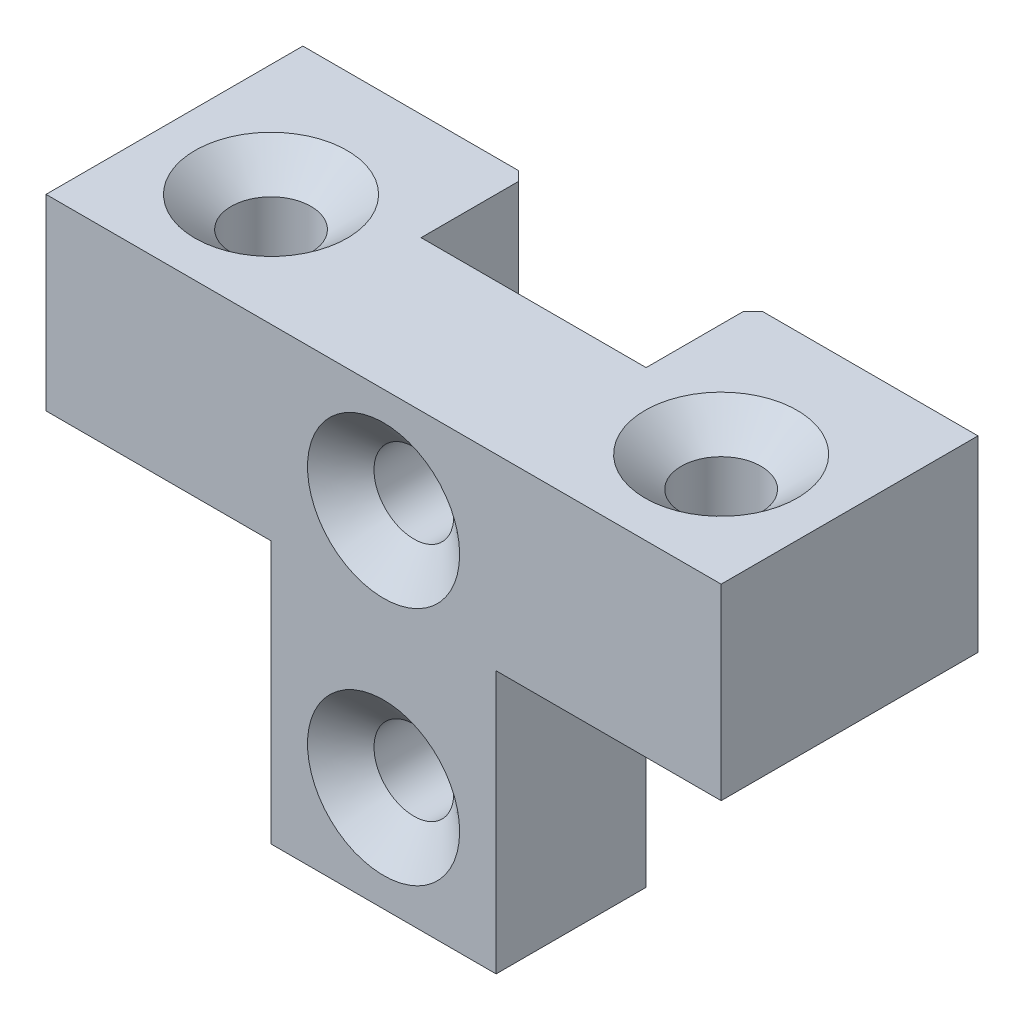
ISO-10303-21;
HEADER;
FILE_DESCRIPTION(('STEP AP214'),'2;1');
FILE_NAME('part.step','',(''),(''),'','','');
FILE_SCHEMA(('AUTOMOTIVE_DESIGN { 1 0 10303 214 1 1 1 1 }'));
ENDSEC;
DATA;
#1=APPLICATION_CONTEXT('core data for automotive mechanical design processes');
#2=APPLICATION_PROTOCOL_DEFINITION('international standard','automotive_design',2000,#1);
#3=PRODUCT_CONTEXT('',#1,'mechanical');
#4=PRODUCT('Part','Part','',(#3));
#5=PRODUCT_RELATED_PRODUCT_CATEGORY('part','',(#4));
#6=PRODUCT_DEFINITION_FORMATION('','',#4);
#7=PRODUCT_DEFINITION_CONTEXT('part definition',#1,'design');
#8=PRODUCT_DEFINITION('design','',#6,#7);
#9=PRODUCT_DEFINITION_SHAPE('','',#8);
#10=(LENGTH_UNIT() NAMED_UNIT(*) SI_UNIT(.MILLI.,.METRE.));
#11=(NAMED_UNIT(*) PLANE_ANGLE_UNIT() SI_UNIT($,.RADIAN.));
#12=(NAMED_UNIT(*) SI_UNIT($,.STERADIAN.) SOLID_ANGLE_UNIT());
#13=UNCERTAINTY_MEASURE_WITH_UNIT(LENGTH_MEASURE(1.E-05),#10,'distance_accuracy_value','');
#14=(GEOMETRIC_REPRESENTATION_CONTEXT(3) GLOBAL_UNCERTAINTY_ASSIGNED_CONTEXT((#13)) GLOBAL_UNIT_ASSIGNED_CONTEXT((#10,
#11,#12)) REPRESENTATION_CONTEXT('',''));
#15=CARTESIAN_POINT('',(0.,0.,0.));
#16=DIRECTION('',(0.,0.,1.));
#17=DIRECTION('',(1.,0.,0.));
#18=AXIS2_PLACEMENT_3D('',#15,#16,#17);
#19=CARTESIAN_POINT('',(0.,0.,-12.7));
#20=DIRECTION('',(0.,0.,-1.));
#21=DIRECTION('',(-1.,0.,0.));
#22=AXIS2_PLACEMENT_3D('',#19,#20,#21);
#23=PLANE('',#22);
#24=DIRECTION('',(0.,-1.,0.));
#25=VECTOR('',#24,1.);
#26=CARTESIAN_POINT('',(9.525,3.175,-12.7));
#27=LINE('',#26,#25);
#28=CARTESIAN_POINT('',(9.525,19.05,-12.7));
#29=VERTEX_POINT('',#28);
#30=CARTESIAN_POINT('',(9.525,3.175,-12.7));
#31=VERTEX_POINT('',#30);
#32=EDGE_CURVE('E152',#29,#31,#27,.T.);
#33=ORIENTED_EDGE('',*,*,#32,.T.);
#34=DIRECTION('',(0.,1.,0.));
#35=VECTOR('',#34,1.);
#36=CARTESIAN_POINT('',(9.525,3.175,-12.7));
#37=LINE('',#36,#35);
#38=CARTESIAN_POINT('',(9.525,-19.05,-12.7));
#39=VERTEX_POINT('',#38);
#40=EDGE_CURVE('E210',#39,#31,#37,.T.);
#41=ORIENTED_EDGE('',*,*,#40,.F.);
#42=DIRECTION('',(1.,0.,0.));
#43=VECTOR('',#42,1.);
#44=CARTESIAN_POINT('',(-9.525,-19.05,-12.7));
#45=LINE('',#44,#43);
#46=CARTESIAN_POINT('',(-9.525,-19.05,-12.7));
#47=VERTEX_POINT('',#46);
#48=EDGE_CURVE('E207',#47,#39,#45,.T.);
#49=ORIENTED_EDGE('',*,*,#48,.F.);
#50=DIRECTION('',(0.,-1.,0.));
#51=VECTOR('',#50,1.);
#52=CARTESIAN_POINT('',(-9.525,3.17500000000001,-12.7));
#53=LINE('',#52,#51);
#54=CARTESIAN_POINT('',(-9.525,3.17500000000001,-12.7));
#55=VERTEX_POINT('',#54);
#56=EDGE_CURVE('E203',#55,#47,#53,.T.);
#57=ORIENTED_EDGE('',*,*,#56,.F.);
#58=DIRECTION('',(0.,1.,0.));
#59=VECTOR('',#58,1.);
#60=CARTESIAN_POINT('',(-9.525,3.17500000000001,-12.7));
#61=LINE('',#60,#59);
#62=CARTESIAN_POINT('',(-9.525,19.05,-12.7));
#63=VERTEX_POINT('',#62);
#64=EDGE_CURVE('E165',#55,#63,#61,.T.);
#65=ORIENTED_EDGE('',*,*,#64,.T.);
#66=DIRECTION('',(-1.,0.,0.));
#67=VECTOR('',#66,1.);
#68=CARTESIAN_POINT('',(-28.575,19.05,-12.7));
#69=LINE('',#68,#67);
#70=EDGE_CURVE('E200',#29,#63,#69,.T.);
#71=ORIENTED_EDGE('',*,*,#70,.F.);
#72=EDGE_LOOP('',(#33,#41,#49,#57,#65,#71));
#73=FACE_BOUND('',#72,.T.);
#74=CARTESIAN_POINT('',(0.,10.16,-12.7));
#75=DIRECTION('',(0.,0.,1.));
#76=DIRECTION('',(1.,0.,0.));
#77=AXIS2_PLACEMENT_3D('',#74,#75,#76);
#78=CIRCLE('',#77,3.3782);
#79=CARTESIAN_POINT('',(3.37819999999999,10.16,-12.7));
#80=VERTEX_POINT('',#79);
#81=EDGE_CURVE('E187',#80,#80,#78,.T.);
#82=ORIENTED_EDGE('',*,*,#81,.T.);
#83=EDGE_LOOP('',(#82));
#84=FACE_BOUND('',#83,.T.);
#85=CARTESIAN_POINT('',(0.,-10.16,-12.7));
#86=DIRECTION('',(0.,0.,1.));
#87=DIRECTION('',(1.,0.,0.));
#88=AXIS2_PLACEMENT_3D('',#85,#86,#87);
#89=CIRCLE('',#88,3.3782);
#90=CARTESIAN_POINT('',(3.3782,-10.16,-12.7));
#91=VERTEX_POINT('',#90);
#92=EDGE_CURVE('E196',#91,#91,#89,.T.);
#93=ORIENTED_EDGE('',*,*,#92,.T.);
#94=EDGE_LOOP('',(#93));
#95=FACE_BOUND('',#94,.T.);
#96=ADVANCED_FACE('F35',(#73,#84,#95),#23,.T.);
#97=CARTESIAN_POINT('',(9.525,3.175,-12.7));
#98=DIRECTION('',(0.,-1.,0.));
#99=DIRECTION('',(0.,0.,-1.));
#100=AXIS2_PLACEMENT_3D('',#97,#98,#99);
#101=PLANE('',#100);
#102=CARTESIAN_POINT('',(19.05,3.175,-9.525));
#103=DIRECTION('',(0.,-1.,0.));
#104=DIRECTION('',(0.,0.,-1.));
#105=AXIS2_PLACEMENT_3D('',#102,#103,#104);
#106=CIRCLE('',#105,3.37819999999999);
#107=CARTESIAN_POINT('',(19.05,3.175,-12.9032));
#108=VERTEX_POINT('',#107);
#109=EDGE_CURVE('E155',#108,#108,#106,.T.);
#110=ORIENTED_EDGE('',*,*,#109,.F.);
#111=EDGE_LOOP('',(#110));
#112=FACE_BOUND('',#111,.T.);
#113=DIRECTION('',(0.,0.,1.));
#114=VECTOR('',#113,1.);
#115=CARTESIAN_POINT('',(9.525,3.175,-21.7424));
#116=LINE('',#115,#114);
#117=CARTESIAN_POINT('',(9.525,3.175,-20.94865));
#118=VERTEX_POINT('',#117);
#119=EDGE_CURVE('E163',#118,#31,#116,.T.);
#120=ORIENTED_EDGE('',*,*,#119,.F.);
#121=DIRECTION('',(-0.707106781186551,0.,0.707106781186544));
#122=VECTOR('',#121,1.);
#123=CARTESIAN_POINT('',(5.400675,3.175,-16.824325));
#124=LINE('',#123,#122);
#125=CARTESIAN_POINT('',(10.31875,3.175,-21.7424));
#126=VERTEX_POINT('',#125);
#127=EDGE_CURVE('E43',#118,#126,#124,.F.);
#128=ORIENTED_EDGE('',*,*,#127,.T.);
#129=DIRECTION('',(1.,0.,0.));
#130=VECTOR('',#129,1.);
#131=CARTESIAN_POINT('',(9.525,3.175,-21.7424));
#132=LINE('',#131,#130);
#133=CARTESIAN_POINT('',(28.575,3.175,-21.7424));
#134=VERTEX_POINT('',#133);
#135=EDGE_CURVE('E147',#126,#134,#132,.T.);
#136=ORIENTED_EDGE('',*,*,#135,.T.);
#137=DIRECTION('',(0.,0.,1.));
#138=VECTOR('',#137,1.);
#139=CARTESIAN_POINT('',(28.575,3.175,-12.7));
#140=LINE('',#139,#138);
#141=CARTESIAN_POINT('',(28.575,3.175,0.));
#142=VERTEX_POINT('',#141);
#143=EDGE_CURVE('E141',#134,#142,#140,.T.);
#144=ORIENTED_EDGE('',*,*,#143,.T.);
#145=DIRECTION('',(1.,0.,0.));
#146=VECTOR('',#145,1.);
#147=CARTESIAN_POINT('',(9.525,3.175,0.));
#148=LINE('',#147,#146);
#149=CARTESIAN_POINT('',(9.525,3.175,0.));
#150=VERTEX_POINT('',#149);
#151=EDGE_CURVE('E204',#150,#142,#148,.T.);
#152=ORIENTED_EDGE('',*,*,#151,.F.);
#153=DIRECTION('',(0.,0.,1.));
#154=VECTOR('',#153,1.);
#155=CARTESIAN_POINT('',(9.525,3.175,-12.7));
#156=LINE('',#155,#154);
#157=EDGE_CURVE('E231',#31,#150,#156,.T.);
#158=ORIENTED_EDGE('',*,*,#157,.F.);
#159=EDGE_LOOP('',(#120,#128,#136,#144,#152,#158));
#160=FACE_BOUND('',#159,.T.);
#161=ADVANCED_FACE('F268',(#112,#160),#101,.T.);
#162=CARTESIAN_POINT('',(9.525,3.175,-12.7));
#163=DIRECTION('',(1.,0.,0.));
#164=DIRECTION('',(0.,1.,0.));
#165=AXIS2_PLACEMENT_3D('',#162,#163,#164);
#166=PLANE('',#165);
#167=DIRECTION('',(0.,1.,0.));
#168=VECTOR('',#167,1.);
#169=CARTESIAN_POINT('',(9.525,3.175,0.));
#170=LINE('',#169,#168);
#171=CARTESIAN_POINT('',(9.525,-19.05,0.));
#172=VERTEX_POINT('',#171);
#173=EDGE_CURVE('E227',#172,#150,#170,.T.);
#174=ORIENTED_EDGE('',*,*,#173,.F.);
#175=DIRECTION('',(0.,0.,1.));
#176=VECTOR('',#175,1.);
#177=CARTESIAN_POINT('',(9.525,-19.05,-12.7));
#178=LINE('',#177,#176);
#179=EDGE_CURVE('E234',#39,#172,#178,.T.);
#180=ORIENTED_EDGE('',*,*,#179,.F.);
#181=ORIENTED_EDGE('',*,*,#40,.T.);
#182=ORIENTED_EDGE('',*,*,#157,.T.);
#183=EDGE_LOOP('',(#174,#180,#181,#182));
#184=FACE_BOUND('',#183,.T.);
#185=ADVANCED_FACE('F273',(#184),#166,.T.);
#186=CARTESIAN_POINT('',(-9.525,-19.05,-12.7));
#187=DIRECTION('',(0.,-1.,0.));
#188=DIRECTION('',(1.,0.,0.));
#189=AXIS2_PLACEMENT_3D('',#186,#187,#188);
#190=PLANE('',#189);
#191=DIRECTION('',(1.,0.,0.));
#192=VECTOR('',#191,1.);
#193=CARTESIAN_POINT('',(-9.525,-19.05,0.));
#194=LINE('',#193,#192);
#195=CARTESIAN_POINT('',(-9.525,-19.05,0.));
#196=VERTEX_POINT('',#195);
#197=EDGE_CURVE('E224',#196,#172,#194,.T.);
#198=ORIENTED_EDGE('',*,*,#197,.F.);
#199=DIRECTION('',(0.,0.,1.));
#200=VECTOR('',#199,1.);
#201=CARTESIAN_POINT('',(-9.525,-19.05,-12.7));
#202=LINE('',#201,#200);
#203=EDGE_CURVE('E236',#47,#196,#202,.T.);
#204=ORIENTED_EDGE('',*,*,#203,.F.);
#205=ORIENTED_EDGE('',*,*,#48,.T.);
#206=ORIENTED_EDGE('',*,*,#179,.T.);
#207=EDGE_LOOP('',(#198,#204,#205,#206));
#208=FACE_BOUND('',#207,.T.);
#209=ADVANCED_FACE('F281',(#208),#190,.T.);
#210=CARTESIAN_POINT('',(-9.525,3.17500000000001,-12.7));
#211=DIRECTION('',(-1.,0.,0.));
#212=DIRECTION('',(0.,-1.,0.));
#213=AXIS2_PLACEMENT_3D('',#210,#211,#212);
#214=PLANE('',#213);
#215=DIRECTION('',(0.,-1.,0.));
#216=VECTOR('',#215,1.);
#217=CARTESIAN_POINT('',(-9.525,3.17500000000001,0.));
#218=LINE('',#217,#216);
#219=CARTESIAN_POINT('',(-9.525,3.17500000000001,0.));
#220=VERTEX_POINT('',#219);
#221=EDGE_CURVE('E221',#220,#196,#218,.T.);
#222=ORIENTED_EDGE('',*,*,#221,.F.);
#223=DIRECTION('',(0.,0.,1.));
#224=VECTOR('',#223,1.);
#225=CARTESIAN_POINT('',(-9.525,3.17500000000001,-12.7));
#226=LINE('',#225,#224);
#227=EDGE_CURVE('E238',#55,#220,#226,.T.);
#228=ORIENTED_EDGE('',*,*,#227,.F.);
#229=ORIENTED_EDGE('',*,*,#56,.T.);
#230=ORIENTED_EDGE('',*,*,#203,.T.);
#231=EDGE_LOOP('',(#222,#228,#229,#230));
#232=FACE_BOUND('',#231,.T.);
#233=ADVANCED_FACE('F284',(#232),#214,.T.);
#234=CARTESIAN_POINT('',(-9.525,3.17500000000001,-12.7));
#235=DIRECTION('',(0.,-1.,0.));
#236=DIRECTION('',(0.,0.,-1.));
#237=AXIS2_PLACEMENT_3D('',#234,#235,#236);
#238=PLANE('',#237);
#239=CARTESIAN_POINT('',(-19.05,3.17500000000001,-9.525));
#240=DIRECTION('',(0.,-1.,0.));
#241=DIRECTION('',(0.,0.,-1.));
#242=AXIS2_PLACEMENT_3D('',#239,#240,#241);
#243=CIRCLE('',#242,3.37819999999999);
#244=CARTESIAN_POINT('',(-19.05,3.17500000000001,-12.9032));
#245=VERTEX_POINT('',#244);
#246=EDGE_CURVE('E247',#245,#245,#243,.T.);
#247=ORIENTED_EDGE('',*,*,#246,.F.);
#248=EDGE_LOOP('',(#247));
#249=FACE_BOUND('',#248,.T.);
#250=DIRECTION('',(1.,0.,0.));
#251=VECTOR('',#250,1.);
#252=CARTESIAN_POINT('',(-28.575,3.17500000000001,-21.7424));
#253=LINE('',#252,#251);
#254=CARTESIAN_POINT('',(-28.575,3.17500000000001,-21.7424));
#255=VERTEX_POINT('',#254);
#256=CARTESIAN_POINT('',(-10.31875,3.17500000000001,-21.7424));
#257=VERTEX_POINT('',#256);
#258=EDGE_CURVE('E167',#255,#257,#253,.T.);
#259=ORIENTED_EDGE('',*,*,#258,.T.);
#260=DIRECTION('',(0.70710678118655,0.,0.707106781186545));
#261=VECTOR('',#260,1.);
#262=CARTESIAN_POINT('',(-5.40067499999999,3.17500000000001,-16.824325));
#263=LINE('',#262,#261);
#264=CARTESIAN_POINT('',(-9.525,3.17500000000001,-20.94865));
#265=VERTEX_POINT('',#264);
#266=EDGE_CURVE('E260',#257,#265,#263,.T.);
#267=ORIENTED_EDGE('',*,*,#266,.T.);
#268=DIRECTION('',(0.,0.,1.));
#269=VECTOR('',#268,1.);
#270=CARTESIAN_POINT('',(-9.525,3.17500000000001,-21.7424));
#271=LINE('',#270,#269);
#272=EDGE_CURVE('E175',#265,#55,#271,.T.);
#273=ORIENTED_EDGE('',*,*,#272,.T.);
#274=ORIENTED_EDGE('',*,*,#227,.T.);
#275=DIRECTION('',(1.,0.,0.));
#276=VECTOR('',#275,1.);
#277=CARTESIAN_POINT('',(-9.525,3.17500000000001,0.));
#278=LINE('',#277,#276);
#279=CARTESIAN_POINT('',(-28.575,3.17500000000001,0.));
#280=VERTEX_POINT('',#279);
#281=EDGE_CURVE('E218',#280,#220,#278,.T.);
#282=ORIENTED_EDGE('',*,*,#281,.F.);
#283=DIRECTION('',(0.,0.,1.));
#284=VECTOR('',#283,1.);
#285=CARTESIAN_POINT('',(-28.575,3.17500000000001,-12.7));
#286=LINE('',#285,#284);
#287=EDGE_CURVE('E240',#255,#280,#286,.T.);
#288=ORIENTED_EDGE('',*,*,#287,.F.);
#289=EDGE_LOOP('',(#259,#267,#273,#274,#282,#288));
#290=FACE_BOUND('',#289,.T.);
#291=ADVANCED_FACE('F319',(#249,#290),#238,.T.);
#292=CARTESIAN_POINT('',(-28.575,19.05,-12.7));
#293=DIRECTION('',(-1.,0.,0.));
#294=DIRECTION('',(0.,-1.,0.));
#295=AXIS2_PLACEMENT_3D('',#292,#293,#294);
#296=PLANE('',#295);
#297=DIRECTION('',(0.,-1.,0.));
#298=VECTOR('',#297,1.);
#299=CARTESIAN_POINT('',(-28.575,19.05,0.));
#300=LINE('',#299,#298);
#301=CARTESIAN_POINT('',(-28.575,19.05,0.));
#302=VERTEX_POINT('',#301);
#303=EDGE_CURVE('E215',#302,#280,#300,.T.);
#304=ORIENTED_EDGE('',*,*,#303,.F.);
#305=DIRECTION('',(0.,0.,1.));
#306=VECTOR('',#305,1.);
#307=CARTESIAN_POINT('',(-28.575,19.05,-12.7));
#308=LINE('',#307,#306);
#309=CARTESIAN_POINT('',(-28.575,19.05,-21.7424));
#310=VERTEX_POINT('',#309);
#311=EDGE_CURVE('E140',#310,#302,#308,.T.);
#312=ORIENTED_EDGE('',*,*,#311,.F.);
#313=DIRECTION('',(0.,-1.,0.));
#314=VECTOR('',#313,1.);
#315=CARTESIAN_POINT('',(-28.575,3.17500000000001,-21.7424));
#316=LINE('',#315,#314);
#317=EDGE_CURVE('E172',#310,#255,#316,.T.);
#318=ORIENTED_EDGE('',*,*,#317,.T.);
#319=ORIENTED_EDGE('',*,*,#287,.T.);
#320=EDGE_LOOP('',(#304,#312,#318,#319));
#321=FACE_BOUND('',#320,.T.);
#322=ADVANCED_FACE('F322',(#321),#296,.T.);
#323=CARTESIAN_POINT('',(-28.575,19.05,-12.7));
#324=DIRECTION('',(0.,1.,0.));
#325=DIRECTION('',(0.,0.,1.));
#326=AXIS2_PLACEMENT_3D('',#323,#324,#325);
#327=PLANE('',#326);
#328=CARTESIAN_POINT('',(-19.05,19.05,-9.525));
#329=DIRECTION('',(0.,1.,0.));
#330=DIRECTION('',(0.,0.,1.));
#331=AXIS2_PLACEMENT_3D('',#328,#329,#330);
#332=CIRCLE('',#331,6.4389);
#333=CARTESIAN_POINT('',(-19.05,19.05,-3.08609999999999));
#334=VERTEX_POINT('',#333);
#335=EDGE_CURVE('E538',#334,#334,#332,.T.);
#336=ORIENTED_EDGE('',*,*,#335,.F.);
#337=EDGE_LOOP('',(#336));
#338=FACE_BOUND('',#337,.T.);
#339=CARTESIAN_POINT('',(19.05,19.05,-9.525));
#340=DIRECTION('',(0.,1.,0.));
#341=DIRECTION('',(0.,0.,1.));
#342=AXIS2_PLACEMENT_3D('',#339,#340,#341);
#343=CIRCLE('',#342,6.4389);
#344=CARTESIAN_POINT('',(19.05,19.05,-3.0861));
#345=VERTEX_POINT('',#344);
#346=EDGE_CURVE('E250',#345,#345,#343,.T.);
#347=ORIENTED_EDGE('',*,*,#346,.F.);
#348=EDGE_LOOP('',(#347));
#349=FACE_BOUND('',#348,.T.);
#350=DIRECTION('',(0.,0.,1.));
#351=VECTOR('',#350,1.);
#352=CARTESIAN_POINT('',(-9.52499999999999,19.05,-21.7424));
#353=LINE('',#352,#351);
#354=CARTESIAN_POINT('',(-9.52499999999999,19.05,-20.94865));
#355=VERTEX_POINT('',#354);
#356=EDGE_CURVE('E178',#355,#63,#353,.T.);
#357=ORIENTED_EDGE('',*,*,#356,.F.);
#358=DIRECTION('',(-0.70710678118655,0.,-0.707106781186545));
#359=VECTOR('',#358,1.);
#360=CARTESIAN_POINT('',(-14.9256750000001,19.05,-26.349325));
#361=LINE('',#360,#359);
#362=CARTESIAN_POINT('',(-10.31875,19.05,-21.7424));
#363=VERTEX_POINT('',#362);
#364=EDGE_CURVE('E256',#355,#363,#361,.T.);
#365=ORIENTED_EDGE('',*,*,#364,.T.);
#366=DIRECTION('',(-1.,0.,0.));
#367=VECTOR('',#366,1.);
#368=CARTESIAN_POINT('',(-9.52499999999999,19.05,-21.7424));
#369=LINE('',#368,#367);
#370=EDGE_CURVE('E170',#363,#310,#369,.T.);
#371=ORIENTED_EDGE('',*,*,#370,.T.);
#372=ORIENTED_EDGE('',*,*,#311,.T.);
#373=DIRECTION('',(-1.,0.,0.));
#374=VECTOR('',#373,1.);
#375=CARTESIAN_POINT('',(-28.575,19.05,0.));
#376=LINE('',#375,#374);
#377=CARTESIAN_POINT('',(28.575,19.05,0.));
#378=VERTEX_POINT('',#377);
#379=EDGE_CURVE('E135',#378,#302,#376,.T.);
#380=ORIENTED_EDGE('',*,*,#379,.F.);
#381=DIRECTION('',(0.,0.,1.));
#382=VECTOR('',#381,1.);
#383=CARTESIAN_POINT('',(28.575,19.05,-12.7));
#384=LINE('',#383,#382);
#385=CARTESIAN_POINT('',(28.575,19.05,-21.7424));
#386=VERTEX_POINT('',#385);
#387=EDGE_CURVE('E128',#386,#378,#384,.T.);
#388=ORIENTED_EDGE('',*,*,#387,.F.);
#389=DIRECTION('',(-1.,0.,0.));
#390=VECTOR('',#389,1.);
#391=CARTESIAN_POINT('',(9.525,19.05,-21.7424));
#392=LINE('',#391,#390);
#393=CARTESIAN_POINT('',(10.31875,19.05,-21.7424));
#394=VERTEX_POINT('',#393);
#395=EDGE_CURVE('E132',#386,#394,#392,.T.);
#396=ORIENTED_EDGE('',*,*,#395,.T.);
#397=DIRECTION('',(0.707106781186551,0.,-0.707106781186544));
#398=VECTOR('',#397,1.);
#399=CARTESIAN_POINT('',(-13.6493250000002,19.05,2.22567499999996));
#400=LINE('',#399,#398);
#401=CARTESIAN_POINT('',(9.525,19.05,-20.94865));
#402=VERTEX_POINT('',#401);
#403=EDGE_CURVE('E254',#394,#402,#400,.F.);
#404=ORIENTED_EDGE('',*,*,#403,.T.);
#405=DIRECTION('',(0.,0.,1.));
#406=VECTOR('',#405,1.);
#407=CARTESIAN_POINT('',(9.525,19.05,-21.7424));
#408=LINE('',#407,#406);
#409=EDGE_CURVE('E161',#402,#29,#408,.T.);
#410=ORIENTED_EDGE('',*,*,#409,.T.);
#411=ORIENTED_EDGE('',*,*,#70,.T.);
#412=EDGE_LOOP('',(#357,#365,#371,#372,#380,#388,#396,#404,#410,#411));
#413=FACE_BOUND('',#412,.T.);
#414=ADVANCED_FACE('F131',(#338,#349,#413),#327,.T.);
#415=CARTESIAN_POINT('',(28.575,19.05,-12.7));
#416=DIRECTION('',(1.,0.,0.));
#417=DIRECTION('',(0.,1.,0.));
#418=AXIS2_PLACEMENT_3D('',#415,#416,#417);
#419=PLANE('',#418);
#420=DIRECTION('',(0.,1.,0.));
#421=VECTOR('',#420,1.);
#422=CARTESIAN_POINT('',(28.575,19.05,0.));
#423=LINE('',#422,#421);
#424=EDGE_CURVE('E199',#142,#378,#423,.T.);
#425=ORIENTED_EDGE('',*,*,#424,.F.);
#426=ORIENTED_EDGE('',*,*,#143,.F.);
#427=DIRECTION('',(0.,1.,0.));
#428=VECTOR('',#427,1.);
#429=CARTESIAN_POINT('',(28.575,3.175,-21.7424));
#430=LINE('',#429,#428);
#431=EDGE_CURVE('E146',#134,#386,#430,.T.);
#432=ORIENTED_EDGE('',*,*,#431,.T.);
#433=ORIENTED_EDGE('',*,*,#387,.T.);
#434=EDGE_LOOP('',(#425,#426,#432,#433));
#435=FACE_BOUND('',#434,.T.);
#436=ADVANCED_FACE('F150',(#435),#419,.T.);
#437=CARTESIAN_POINT('',(0.,0.,0.));
#438=DIRECTION('',(0.,0.,-1.));
#439=DIRECTION('',(-1.,0.,0.));
#440=AXIS2_PLACEMENT_3D('',#437,#438,#439);
#441=PLANE('',#440);
#442=CARTESIAN_POINT('',(0.,10.16,0.));
#443=DIRECTION('',(0.,0.,1.));
#444=DIRECTION('',(1.,0.,0.));
#445=AXIS2_PLACEMENT_3D('',#442,#443,#444);
#446=CIRCLE('',#445,6.4389);
#447=CARTESIAN_POINT('',(6.4389,10.16,0.));
#448=VERTEX_POINT('',#447);
#449=EDGE_CURVE('E180',#448,#448,#446,.T.);
#450=ORIENTED_EDGE('',*,*,#449,.F.);
#451=EDGE_LOOP('',(#450));
#452=FACE_BOUND('',#451,.T.);
#453=CARTESIAN_POINT('',(0.,-10.16,0.));
#454=DIRECTION('',(0.,0.,1.));
#455=DIRECTION('',(1.,0.,0.));
#456=AXIS2_PLACEMENT_3D('',#453,#454,#455);
#457=CIRCLE('',#456,6.4389);
#458=CARTESIAN_POINT('',(6.4389,-10.16,0.));
#459=VERTEX_POINT('',#458);
#460=EDGE_CURVE('E190',#459,#459,#457,.T.);
#461=ORIENTED_EDGE('',*,*,#460,.F.);
#462=EDGE_LOOP('',(#461));
#463=FACE_BOUND('',#462,.T.);
#464=ORIENTED_EDGE('',*,*,#151,.T.);
#465=ORIENTED_EDGE('',*,*,#424,.T.);
#466=ORIENTED_EDGE('',*,*,#379,.T.);
#467=ORIENTED_EDGE('',*,*,#303,.T.);
#468=ORIENTED_EDGE('',*,*,#281,.T.);
#469=ORIENTED_EDGE('',*,*,#221,.T.);
#470=ORIENTED_EDGE('',*,*,#197,.T.);
#471=ORIENTED_EDGE('',*,*,#173,.T.);
#472=EDGE_LOOP('',(#464,#465,#466,#467,#468,#469,#470,#471));
#473=FACE_BOUND('',#472,.T.);
#474=ADVANCED_FACE('F309',(#452,#463,#473),#441,.F.);
#475=CARTESIAN_POINT('',(0.,-10.16,0.));
#476=DIRECTION('',(0.,0.,1.));
#477=DIRECTION('',(1.,0.,0.));
#478=AXIS2_PLACEMENT_3D('',#475,#476,#477);
#479=CYLINDRICAL_SURFACE('',#478,3.3782);
#480=ORIENTED_EDGE('',*,*,#92,.F.);
#481=EDGE_LOOP('',(#480));
#482=FACE_BOUND('',#481,.T.);
#483=CARTESIAN_POINT('',(0.,-10.16,-2.56823224114431));
#484=DIRECTION('',(0.,0.,1.));
#485=DIRECTION('',(1.,0.,0.));
#486=AXIS2_PLACEMENT_3D('',#483,#484,#485);
#487=CIRCLE('',#486,3.3782);
#488=CARTESIAN_POINT('',(3.3782,-10.16,-2.56823224114431));
#489=VERTEX_POINT('',#488);
#490=EDGE_CURVE('E193',#489,#489,#487,.T.);
#491=ORIENTED_EDGE('',*,*,#490,.T.);
#492=EDGE_LOOP('',(#491));
#493=FACE_BOUND('',#492,.T.);
#494=ADVANCED_FACE('F307',(#482,#493),#479,.F.);
#495=CARTESIAN_POINT('',(0.,-10.16,0.));
#496=DIRECTION('',(0.,0.,1.));
#497=DIRECTION('',(1.,0.,0.));
#498=AXIS2_PLACEMENT_3D('',#495,#496,#497);
#499=CONICAL_SURFACE('',#498,6.4389,0.872664625997164);
#500=ORIENTED_EDGE('',*,*,#490,.F.);
#501=EDGE_LOOP('',(#500));
#502=FACE_BOUND('',#501,.T.);
#503=ORIENTED_EDGE('',*,*,#460,.T.);
#504=EDGE_LOOP('',(#503));
#505=FACE_BOUND('',#504,.T.);
#506=ADVANCED_FACE('F348',(#502,#505),#499,.F.);
#507=CARTESIAN_POINT('',(0.,10.16,0.));
#508=DIRECTION('',(0.,0.,1.));
#509=DIRECTION('',(1.,0.,0.));
#510=AXIS2_PLACEMENT_3D('',#507,#508,#509);
#511=CYLINDRICAL_SURFACE('',#510,3.3782);
#512=ORIENTED_EDGE('',*,*,#81,.F.);
#513=EDGE_LOOP('',(#512));
#514=FACE_BOUND('',#513,.T.);
#515=CARTESIAN_POINT('',(0.,10.16,-2.56823224114431));
#516=DIRECTION('',(0.,0.,1.));
#517=DIRECTION('',(1.,0.,0.));
#518=AXIS2_PLACEMENT_3D('',#515,#516,#517);
#519=CIRCLE('',#518,3.3782);
#520=CARTESIAN_POINT('',(3.37819999999999,10.16,-2.56823224114431));
#521=VERTEX_POINT('',#520);
#522=EDGE_CURVE('E184',#521,#521,#519,.T.);
#523=ORIENTED_EDGE('',*,*,#522,.T.);
#524=EDGE_LOOP('',(#523));
#525=FACE_BOUND('',#524,.T.);
#526=ADVANCED_FACE('F355',(#514,#525),#511,.F.);
#527=CARTESIAN_POINT('',(0.,10.16,0.));
#528=DIRECTION('',(0.,0.,1.));
#529=DIRECTION('',(1.,0.,0.));
#530=AXIS2_PLACEMENT_3D('',#527,#528,#529);
#531=CONICAL_SURFACE('',#530,6.4389,0.872664625997164);
#532=ORIENTED_EDGE('',*,*,#522,.F.);
#533=EDGE_LOOP('',(#532));
#534=FACE_BOUND('',#533,.T.);
#535=ORIENTED_EDGE('',*,*,#449,.T.);
#536=EDGE_LOOP('',(#535));
#537=FACE_BOUND('',#536,.T.);
#538=ADVANCED_FACE('F362',(#534,#537),#531,.F.);
#539=CARTESIAN_POINT('',(-9.525,3.17500000000001,-21.7424));
#540=DIRECTION('',(1.,0.,0.));
#541=DIRECTION('',(0.,1.,0.));
#542=AXIS2_PLACEMENT_3D('',#539,#540,#541);
#543=PLANE('',#542);
#544=ORIENTED_EDGE('',*,*,#272,.F.);
#545=DIRECTION('',(0.,1.,0.));
#546=VECTOR('',#545,1.);
#547=CARTESIAN_POINT('',(-9.52499999999999,19.05,-20.94865));
#548=LINE('',#547,#546);
#549=EDGE_CURVE('E233',#265,#355,#548,.T.);
#550=ORIENTED_EDGE('',*,*,#549,.T.);
#551=ORIENTED_EDGE('',*,*,#356,.T.);
#552=ORIENTED_EDGE('',*,*,#64,.F.);
#553=EDGE_LOOP('',(#544,#550,#551,#552));
#554=FACE_BOUND('',#553,.T.);
#555=ADVANCED_FACE('F289',(#554),#543,.T.);
#556=CARTESIAN_POINT('',(0.,0.,-21.7424));
#557=DIRECTION('',(0.,0.,1.));
#558=DIRECTION('',(1.,0.,0.));
#559=AXIS2_PLACEMENT_3D('',#556,#557,#558);
#560=PLANE('',#559);
#561=ORIENTED_EDGE('',*,*,#370,.F.);
#562=DIRECTION('',(0.,-1.,0.));
#563=VECTOR('',#562,1.);
#564=CARTESIAN_POINT('',(-10.31875,3.17500000000001,-21.7424));
#565=LINE('',#564,#563);
#566=EDGE_CURVE('E258',#363,#257,#565,.T.);
#567=ORIENTED_EDGE('',*,*,#566,.T.);
#568=ORIENTED_EDGE('',*,*,#258,.F.);
#569=ORIENTED_EDGE('',*,*,#317,.F.);
#570=EDGE_LOOP('',(#561,#567,#568,#569));
#571=FACE_BOUND('',#570,.T.);
#572=ADVANCED_FACE('F377',(#571),#560,.F.);
#573=CARTESIAN_POINT('',(9.525,3.175,-21.7424));
#574=DIRECTION('',(-1.,0.,0.));
#575=DIRECTION('',(0.,0.,1.));
#576=AXIS2_PLACEMENT_3D('',#573,#574,#575);
#577=PLANE('',#576);
#578=ORIENTED_EDGE('',*,*,#409,.F.);
#579=DIRECTION('',(0.,-1.,0.));
#580=VECTOR('',#579,1.);
#581=CARTESIAN_POINT('',(9.525,3.175,-20.94865));
#582=LINE('',#581,#580);
#583=EDGE_CURVE('E262',#402,#118,#582,.T.);
#584=ORIENTED_EDGE('',*,*,#583,.T.);
#585=ORIENTED_EDGE('',*,*,#119,.T.);
#586=ORIENTED_EDGE('',*,*,#32,.F.);
#587=EDGE_LOOP('',(#578,#584,#585,#586));
#588=FACE_BOUND('',#587,.T.);
#589=ADVANCED_FACE('F265',(#588),#577,.T.);
#590=CARTESIAN_POINT('',(0.,0.,-21.7424));
#591=DIRECTION('',(0.,0.,-1.));
#592=DIRECTION('',(-1.,0.,0.));
#593=AXIS2_PLACEMENT_3D('',#590,#591,#592);
#594=PLANE('',#593);
#595=ORIENTED_EDGE('',*,*,#135,.F.);
#596=DIRECTION('',(0.,1.,0.));
#597=VECTOR('',#596,1.);
#598=CARTESIAN_POINT('',(10.31875,0.,-21.7424));
#599=LINE('',#598,#597);
#600=EDGE_CURVE('E11',#126,#394,#599,.T.);
#601=ORIENTED_EDGE('',*,*,#600,.T.);
#602=ORIENTED_EDGE('',*,*,#395,.F.);
#603=ORIENTED_EDGE('',*,*,#431,.F.);
#604=EDGE_LOOP('',(#595,#601,#602,#603));
#605=FACE_BOUND('',#604,.T.);
#606=ADVANCED_FACE('F145',(#605),#594,.T.);
#607=CARTESIAN_POINT('',(19.05,19.05,-9.525));
#608=DIRECTION('',(0.,1.,0.));
#609=DIRECTION('',(0.,0.,1.));
#610=AXIS2_PLACEMENT_3D('',#607,#608,#609);
#611=CYLINDRICAL_SURFACE('',#610,3.37819999999999);
#612=ORIENTED_EDGE('',*,*,#109,.T.);
#613=EDGE_LOOP('',(#612));
#614=FACE_BOUND('',#613,.T.);
#615=CARTESIAN_POINT('',(19.05,16.4817677588557,-9.525));
#616=DIRECTION('',(0.,1.,0.));
#617=DIRECTION('',(0.,0.,1.));
#618=AXIS2_PLACEMENT_3D('',#615,#616,#617);
#619=CIRCLE('',#618,3.37819999999999);
#620=CARTESIAN_POINT('',(19.05,16.4817677588557,-6.14680000000001));
#621=VERTEX_POINT('',#620);
#622=EDGE_CURVE('E158',#621,#621,#619,.T.);
#623=ORIENTED_EDGE('',*,*,#622,.T.);
#624=EDGE_LOOP('',(#623));
#625=FACE_BOUND('',#624,.T.);
#626=ADVANCED_FACE('F397',(#614,#625),#611,.F.);
#627=CARTESIAN_POINT('',(19.05,19.05,-9.525));
#628=DIRECTION('',(0.,1.,0.));
#629=DIRECTION('',(0.,0.,1.));
#630=AXIS2_PLACEMENT_3D('',#627,#628,#629);
#631=CONICAL_SURFACE('',#630,6.4389,0.872664625997164);
#632=ORIENTED_EDGE('',*,*,#622,.F.);
#633=EDGE_LOOP('',(#632));
#634=FACE_BOUND('',#633,.T.);
#635=ORIENTED_EDGE('',*,*,#346,.T.);
#636=EDGE_LOOP('',(#635));
#637=FACE_BOUND('',#636,.T.);
#638=ADVANCED_FACE('F404',(#634,#637),#631,.F.);
#639=CARTESIAN_POINT('',(-19.05,19.05,-9.525));
#640=DIRECTION('',(0.,1.,0.));
#641=DIRECTION('',(0.,0.,1.));
#642=AXIS2_PLACEMENT_3D('',#639,#640,#641);
#643=CYLINDRICAL_SURFACE('',#642,3.37819999999999);
#644=ORIENTED_EDGE('',*,*,#246,.T.);
#645=EDGE_LOOP('',(#644));
#646=FACE_BOUND('',#645,.T.);
#647=CARTESIAN_POINT('',(-19.05,16.4817677588557,-9.525));
#648=DIRECTION('',(0.,1.,0.));
#649=DIRECTION('',(0.,0.,1.));
#650=AXIS2_PLACEMENT_3D('',#647,#648,#649);
#651=CIRCLE('',#650,3.37819999999999);
#652=CARTESIAN_POINT('',(-19.05,16.4817677588557,-6.1468));
#653=VERTEX_POINT('',#652);
#654=EDGE_CURVE('E251',#653,#653,#651,.T.);
#655=ORIENTED_EDGE('',*,*,#654,.T.);
#656=EDGE_LOOP('',(#655));
#657=FACE_BOUND('',#656,.T.);
#658=ADVANCED_FACE('F412',(#646,#657),#643,.F.);
#659=CARTESIAN_POINT('',(-19.05,19.05,-9.525));
#660=DIRECTION('',(0.,1.,0.));
#661=DIRECTION('',(0.,0.,1.));
#662=AXIS2_PLACEMENT_3D('',#659,#660,#661);
#663=CONICAL_SURFACE('',#662,6.4389,0.872664625997164);
#664=ORIENTED_EDGE('',*,*,#654,.F.);
#665=EDGE_LOOP('',(#664));
#666=FACE_BOUND('',#665,.T.);
#667=ORIENTED_EDGE('',*,*,#335,.T.);
#668=EDGE_LOOP('',(#667));
#669=FACE_BOUND('',#668,.T.);
#670=ADVANCED_FACE('F296',(#666,#669),#663,.F.);
#671=CARTESIAN_POINT('',(-9.525,3.17500000000001,-20.94865));
#672=DIRECTION('',(0.707106781186545,0.,-0.707106781186551));
#673=DIRECTION('',(0.,-1.,0.));
#674=AXIS2_PLACEMENT_3D('',#671,#672,#673);
#675=PLANE('',#674);
#676=ORIENTED_EDGE('',*,*,#266,.F.);
#677=ORIENTED_EDGE('',*,*,#566,.F.);
#678=ORIENTED_EDGE('',*,*,#364,.F.);
#679=ORIENTED_EDGE('',*,*,#549,.F.);
#680=EDGE_LOOP('',(#676,#677,#678,#679));
#681=FACE_BOUND('',#680,.T.);
#682=ADVANCED_FACE('F292',(#681),#675,.T.);
#683=CARTESIAN_POINT('',(9.525,3.175,-20.94865));
#684=DIRECTION('',(0.707106781186544,0.,0.707106781186551));
#685=DIRECTION('',(0.,-1.,0.));
#686=AXIS2_PLACEMENT_3D('',#683,#684,#685);
#687=PLANE('',#686);
#688=ORIENTED_EDGE('',*,*,#403,.F.);
#689=ORIENTED_EDGE('',*,*,#600,.F.);
#690=ORIENTED_EDGE('',*,*,#127,.F.);
#691=ORIENTED_EDGE('',*,*,#583,.F.);
#692=EDGE_LOOP('',(#688,#689,#690,#691));
#693=FACE_BOUND('',#692,.T.);
#694=ADVANCED_FACE('F37',(#693),#687,.F.);
#695=CLOSED_SHELL('',(#96,#161,#185,#209,#233,#291,#322,#414,#436,#474,#494,#506,#526,#538,#555,
#572,#589,#606,#626,#638,#658,#670,#682,#694));
#696=MANIFOLD_SOLID_BREP('B2',#695);
#697=ADVANCED_BREP_SHAPE_REPRESENTATION('',(#18,#696),#14);
#698=SHAPE_DEFINITION_REPRESENTATION(#9,#697);
ENDSEC;
END-ISO-10303-21;
